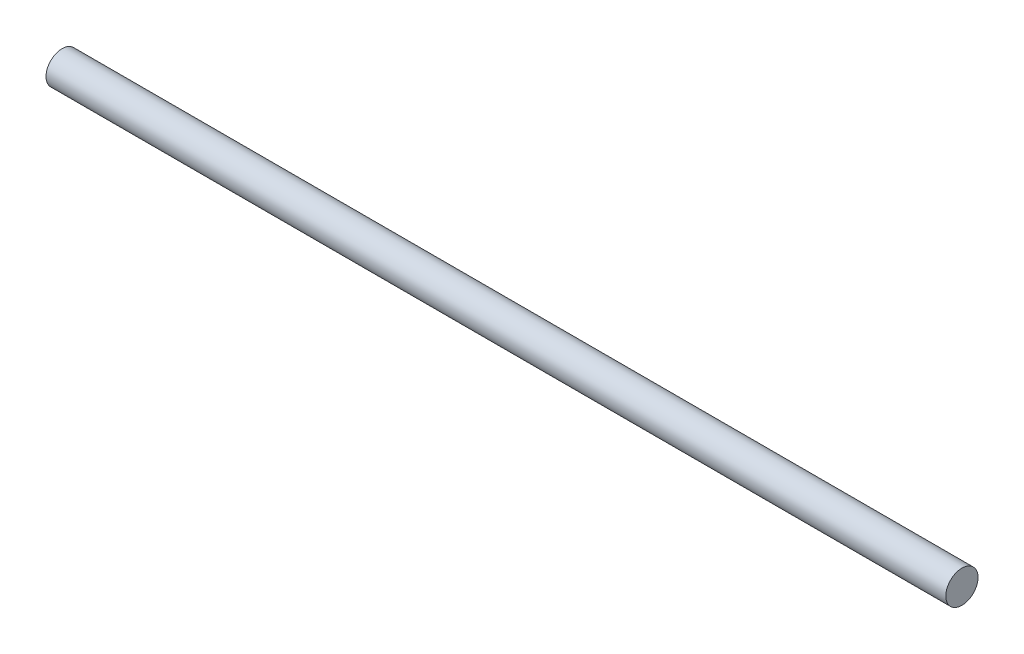
ISO-10303-21;
HEADER;
FILE_DESCRIPTION(('STEP AP214'),'2;1');
FILE_NAME('part.step','',(''),(''),'','','');
FILE_SCHEMA(('AUTOMOTIVE_DESIGN { 1 0 10303 214 1 1 1 1 }'));
ENDSEC;
DATA;
#1=APPLICATION_CONTEXT('core data for automotive mechanical design processes');
#2=APPLICATION_PROTOCOL_DEFINITION('international standard','automotive_design',2000,#1);
#3=PRODUCT_CONTEXT('',#1,'mechanical');
#4=PRODUCT('Part','Part','',(#3));
#5=PRODUCT_RELATED_PRODUCT_CATEGORY('part','',(#4));
#6=PRODUCT_DEFINITION_FORMATION('','',#4);
#7=PRODUCT_DEFINITION_CONTEXT('part definition',#1,'design');
#8=PRODUCT_DEFINITION('design','',#6,#7);
#9=PRODUCT_DEFINITION_SHAPE('','',#8);
#10=(LENGTH_UNIT() NAMED_UNIT(*) SI_UNIT(.MILLI.,.METRE.));
#11=(NAMED_UNIT(*) PLANE_ANGLE_UNIT() SI_UNIT($,.RADIAN.));
#12=(NAMED_UNIT(*) SI_UNIT($,.STERADIAN.) SOLID_ANGLE_UNIT());
#13=UNCERTAINTY_MEASURE_WITH_UNIT(LENGTH_MEASURE(1.E-05),#10,'distance_accuracy_value','');
#14=(GEOMETRIC_REPRESENTATION_CONTEXT(3) GLOBAL_UNCERTAINTY_ASSIGNED_CONTEXT((#13)) GLOBAL_UNIT_ASSIGNED_CONTEXT((#10,
#11,#12)) REPRESENTATION_CONTEXT('',''));
#15=CARTESIAN_POINT('',(0.,0.,0.));
#16=DIRECTION('',(0.,0.,1.));
#17=DIRECTION('',(1.,0.,0.));
#18=AXIS2_PLACEMENT_3D('',#15,#16,#17);
#19=CARTESIAN_POINT('',(0.,0.,0.));
#20=DIRECTION('',(1.,0.,0.));
#21=DIRECTION('',(0.,0.,-1.));
#22=AXIS2_PLACEMENT_3D('',#19,#20,#21);
#23=PLANE('',#22);
#24=CARTESIAN_POINT('',(0.,0.,0.));
#25=DIRECTION('',(-1.,0.,0.));
#26=DIRECTION('',(0.,0.,1.));
#27=AXIS2_PLACEMENT_3D('',#24,#25,#26);
#28=CIRCLE('',#27,3.96875);
#29=CARTESIAN_POINT('',(0.,0.,3.96875));
#30=VERTEX_POINT('',#29);
#31=EDGE_CURVE('E10',#30,#30,#28,.T.);
#32=ORIENTED_EDGE('',*,*,#31,.T.);
#33=EDGE_LOOP('',(#32));
#34=FACE_BOUND('',#33,.T.);
#35=ADVANCED_FACE('F31',(#34),#23,.F.);
#36=CARTESIAN_POINT('',(0.,0.,0.));
#37=DIRECTION('',(-1.,0.,0.));
#38=DIRECTION('',(0.,0.,1.));
#39=AXIS2_PLACEMENT_3D('',#36,#37,#38);
#40=CYLINDRICAL_SURFACE('',#39,3.96875);
#41=ORIENTED_EDGE('',*,*,#31,.F.);
#42=EDGE_LOOP('',(#41));
#43=FACE_BOUND('',#42,.T.);
#44=CARTESIAN_POINT('',(221.522352045655,0.,0.));
#45=DIRECTION('',(-1.,0.,0.));
#46=DIRECTION('',(0.,0.,1.));
#47=AXIS2_PLACEMENT_3D('',#44,#45,#46);
#48=CIRCLE('',#47,3.96875);
#49=CARTESIAN_POINT('',(221.522352045655,0.,3.96875));
#50=VERTEX_POINT('',#49);
#51=EDGE_CURVE('E37',#50,#50,#48,.T.);
#52=ORIENTED_EDGE('',*,*,#51,.T.);
#53=EDGE_LOOP('',(#52));
#54=FACE_BOUND('',#53,.T.);
#55=ADVANCED_FACE('F43',(#43,#54),#40,.T.);
#56=CARTESIAN_POINT('',(221.522352045655,3.96875,0.));
#57=DIRECTION('',(-1.,0.,0.));
#58=DIRECTION('',(0.,0.,1.));
#59=AXIS2_PLACEMENT_3D('',#56,#57,#58);
#60=PLANE('',#59);
#61=ORIENTED_EDGE('',*,*,#51,.F.);
#62=EDGE_LOOP('',(#61));
#63=FACE_BOUND('',#62,.T.);
#64=ADVANCED_FACE('F45',(#63),#60,.F.);
#65=CLOSED_SHELL('',(#35,#55,#64));
#66=MANIFOLD_SOLID_BREP('B2',#65);
#67=ADVANCED_BREP_SHAPE_REPRESENTATION('',(#18,#66),#14);
#68=SHAPE_DEFINITION_REPRESENTATION(#9,#67);
ENDSEC;
END-ISO-10303-21;
